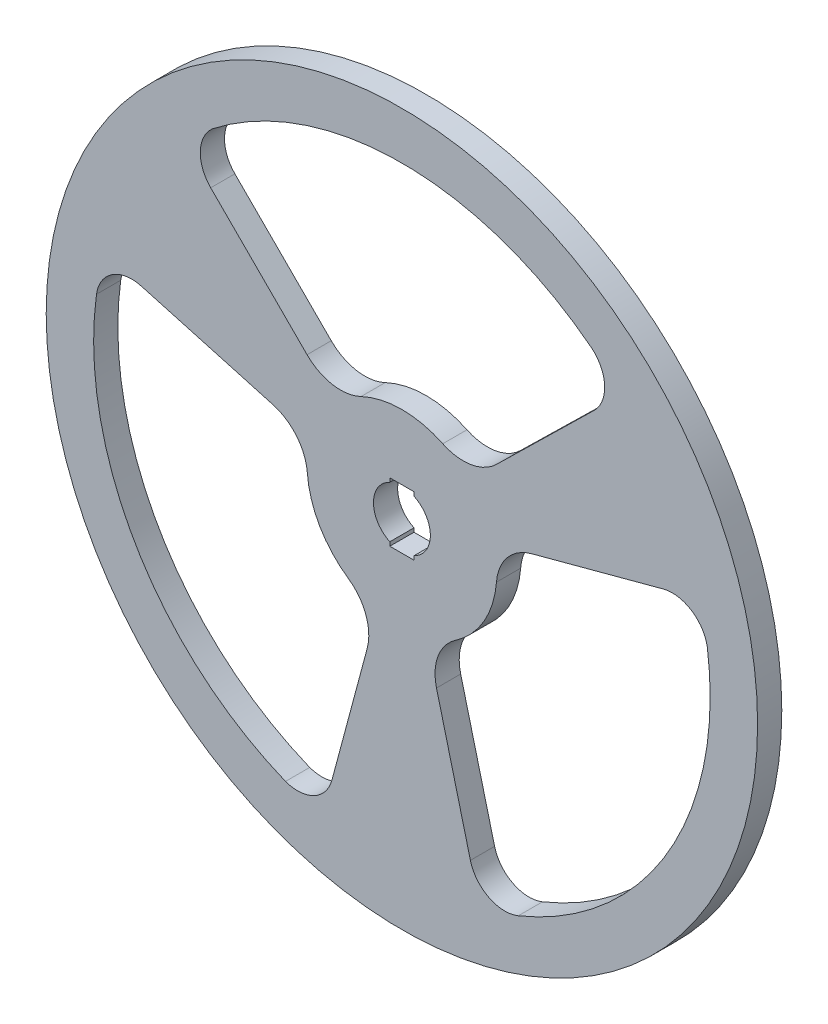
ISO-10303-21;
HEADER;
FILE_DESCRIPTION(('STEP AP214'),'2;1');
FILE_NAME('part.step','',(''),(''),'','','');
FILE_SCHEMA(('AUTOMOTIVE_DESIGN { 1 0 10303 214 1 1 1 1 }'));
ENDSEC;
DATA;
#1=APPLICATION_CONTEXT('core data for automotive mechanical design processes');
#2=APPLICATION_PROTOCOL_DEFINITION('international standard','automotive_design',2000,#1);
#3=PRODUCT_CONTEXT('',#1,'mechanical');
#4=PRODUCT('Part','Part','',(#3));
#5=PRODUCT_RELATED_PRODUCT_CATEGORY('part','',(#4));
#6=PRODUCT_DEFINITION_FORMATION('','',#4);
#7=PRODUCT_DEFINITION_CONTEXT('part definition',#1,'design');
#8=PRODUCT_DEFINITION('design','',#6,#7);
#9=PRODUCT_DEFINITION_SHAPE('','',#8);
#10=(LENGTH_UNIT() NAMED_UNIT(*) SI_UNIT(.MILLI.,.METRE.));
#11=(NAMED_UNIT(*) PLANE_ANGLE_UNIT() SI_UNIT($,.RADIAN.));
#12=(NAMED_UNIT(*) SI_UNIT($,.STERADIAN.) SOLID_ANGLE_UNIT());
#13=UNCERTAINTY_MEASURE_WITH_UNIT(LENGTH_MEASURE(1.E-05),#10,'distance_accuracy_value','');
#14=(GEOMETRIC_REPRESENTATION_CONTEXT(3) GLOBAL_UNCERTAINTY_ASSIGNED_CONTEXT((#13)) GLOBAL_UNIT_ASSIGNED_CONTEXT((#10,
#11,#12)) REPRESENTATION_CONTEXT('',''));
#15=CARTESIAN_POINT('',(0.,0.,0.));
#16=DIRECTION('',(0.,0.,1.));
#17=DIRECTION('',(1.,0.,0.));
#18=AXIS2_PLACEMENT_3D('',#15,#16,#17);
#19=CARTESIAN_POINT('',(0.,0.,5.1));
#20=DIRECTION('',(0.,0.,-1.));
#21=DIRECTION('',(-1.,0.,0.));
#22=AXIS2_PLACEMENT_3D('',#19,#20,#21);
#23=CYLINDRICAL_SURFACE('',#22,6.);
#24=CARTESIAN_POINT('',(0.,0.,5.1));
#25=DIRECTION('',(0.,0.,1.));
#26=DIRECTION('',(1.,0.,0.));
#27=AXIS2_PLACEMENT_3D('',#24,#25,#26);
#28=CIRCLE('',#27,6.);
#29=CARTESIAN_POINT('',(-2.55,5.4311600970695,5.1));
#30=VERTEX_POINT('',#29);
#31=CARTESIAN_POINT('',(-2.55,-5.4311600970695,5.1));
#32=VERTEX_POINT('',#31);
#33=EDGE_CURVE('E392',#30,#32,#28,.T.);
#34=ORIENTED_EDGE('',*,*,#33,.T.);
#35=DIRECTION('',(0.,0.,-1.));
#36=VECTOR('',#35,1.);
#37=CARTESIAN_POINT('',(-2.55,-5.4311600970695,5.1));
#38=LINE('',#37,#36);
#39=CARTESIAN_POINT('',(-2.55,-5.4311600970695,0.));
#40=VERTEX_POINT('',#39);
#41=EDGE_CURVE('E322',#32,#40,#38,.T.);
#42=ORIENTED_EDGE('',*,*,#41,.T.);
#43=CARTESIAN_POINT('',(0.,0.,0.));
#44=DIRECTION('',(0.,0.,1.));
#45=DIRECTION('',(1.,0.,0.));
#46=AXIS2_PLACEMENT_3D('',#43,#44,#45);
#47=CIRCLE('',#46,6.);
#48=CARTESIAN_POINT('',(-2.55,5.4311600970695,0.));
#49=VERTEX_POINT('',#48);
#50=EDGE_CURVE('E296',#49,#40,#47,.T.);
#51=ORIENTED_EDGE('',*,*,#50,.F.);
#52=DIRECTION('',(0.,0.,-1.));
#53=VECTOR('',#52,1.);
#54=CARTESIAN_POINT('',(-2.55,5.4311600970695,5.1));
#55=LINE('',#54,#53);
#56=EDGE_CURVE('E319',#49,#30,#55,.F.);
#57=ORIENTED_EDGE('',*,*,#56,.T.);
#58=EDGE_LOOP('',(#34,#42,#51,#57));
#59=FACE_BOUND('',#58,.T.);
#60=ADVANCED_FACE('F63',(#59),#23,.F.);
#61=CARTESIAN_POINT('',(0.,0.,5.1));
#62=DIRECTION('',(0.,0.,1.));
#63=DIRECTION('',(1.,0.,0.));
#64=AXIS2_PLACEMENT_3D('',#61,#62,#63);
#65=PLANE('',#64);
#66=CARTESIAN_POINT('',(35.2574137113782,45.4220736909349,5.1));
#67=DIRECTION('',(0.,0.,1.));
#68=DIRECTION('',(1.,0.,0.));
#69=AXIS2_PLACEMENT_3D('',#66,#67,#68);
#70=CIRCLE('',#69,7.5);
#71=CARTESIAN_POINT('',(40.5028174644511,40.0615010100313,5.1));
#72=VERTEX_POINT('',#71);
#73=CARTESIAN_POINT('',(39.8562068041667,51.3466919984481,5.1));
#74=VERTEX_POINT('',#73);
#75=EDGE_CURVE('E325',#72,#74,#70,.T.);
#76=ORIENTED_EDGE('',*,*,#75,.F.);
#77=DIRECTION('',(-0.714743024120474,-0.699387167076377,0.));
#78=VECTOR('',#77,1.);
#79=CARTESIAN_POINT('',(-0.214381482132728,0.219088476409293,5.1));
#80=LINE('',#79,#78);
#81=CARTESIAN_POINT('',(19.9228038588983,19.9236375706607,5.1));
#82=VERTEX_POINT('',#81);
#83=EDGE_CURVE('E328',#72,#82,#80,.T.);
#84=ORIENTED_EDGE('',*,*,#83,.T.);
#85=CARTESIAN_POINT('',(12.9289321881345,27.0710678118655,5.1));
#86=DIRECTION('',(0.,0.,1.));
#87=DIRECTION('',(1.,0.,0.));
#88=AXIS2_PLACEMENT_3D('',#85,#86,#87);
#89=CIRCLE('',#88,10.);
#90=CARTESIAN_POINT('',(8.61928812542301,18.0473785412437,5.1));
#91=VERTEX_POINT('',#90);
#92=EDGE_CURVE('E331',#91,#82,#89,.T.);
#93=ORIENTED_EDGE('',*,*,#92,.F.);
#94=CARTESIAN_POINT('',(0.,0.,5.1));
#95=DIRECTION('',(0.,0.,1.));
#96=DIRECTION('',(1.,0.,0.));
#97=AXIS2_PLACEMENT_3D('',#94,#95,#96);
#98=CIRCLE('',#97,20.);
#99=CARTESIAN_POINT('',(-8.61928812542303,18.0473785412436,5.1));
#100=VERTEX_POINT('',#99);
#101=EDGE_CURVE('E334',#91,#100,#98,.T.);
#102=ORIENTED_EDGE('',*,*,#101,.T.);
#103=CARTESIAN_POINT('',(-12.9289321881345,27.0710678118655,5.1));
#104=DIRECTION('',(0.,0.,1.));
#105=DIRECTION('',(1.,0.,0.));
#106=AXIS2_PLACEMENT_3D('',#103,#104,#105);
#107=CIRCLE('',#106,10.);
#108=CARTESIAN_POINT('',(-20.,20.,5.1));
#109=VERTEX_POINT('',#108);
#110=EDGE_CURVE('E336',#109,#100,#107,.T.);
#111=ORIENTED_EDGE('',*,*,#110,.F.);
#112=DIRECTION('',(-0.707106781186548,0.707106781186547,0.));
#113=VECTOR('',#112,1.);
#114=CARTESIAN_POINT('',(0.,0.,5.1));
#115=LINE('',#114,#113);
#116=CARTESIAN_POINT('',(-40.316594862155,40.316594862155,5.1));
#117=VERTEX_POINT('',#116);
#118=EDGE_CURVE('E339',#109,#117,#115,.T.);
#119=ORIENTED_EDGE('',*,*,#118,.T.);
#120=CARTESIAN_POINT('',(-35.0132940032559,45.6198957210541,5.1));
#121=DIRECTION('',(0.,0.,1.));
#122=DIRECTION('',(1.,0.,0.));
#123=AXIS2_PLACEMENT_3D('',#120,#121,#122);
#124=CIRCLE('',#123,7.50000000000001);
#125=CARTESIAN_POINT('',(-39.8562068041667,51.3466919984481,5.1));
#126=VERTEX_POINT('',#125);
#127=EDGE_CURVE('E341',#126,#117,#124,.T.);
#128=ORIENTED_EDGE('',*,*,#127,.F.);
#129=CARTESIAN_POINT('',(0.,0.,5.1));
#130=DIRECTION('',(0.,0.,1.));
#131=DIRECTION('',(1.,0.,0.));
#132=AXIS2_PLACEMENT_3D('',#129,#130,#131);
#133=CIRCLE('',#132,65.);
#134=EDGE_CURVE('E344',#74,#126,#133,.T.);
#135=ORIENTED_EDGE('',*,*,#134,.F.);
#136=EDGE_LOOP('',(#76,#84,#93,#102,#111,#119,#128,#135));
#137=FACE_BOUND('',#136,.T.);
#138=CARTESIAN_POINT('',(-56.9653765646075,7.82277910032393,5.1));
#139=DIRECTION('',(0.,0.,1.));
#140=DIRECTION('',(1.,0.,0.));
#141=AXIS2_PLACEMENT_3D('',#138,#139,#140);
#142=CIRCLE('',#141,7.5);
#143=CARTESIAN_POINT('',(-54.9456863206486,15.045718344043,5.1));
#144=VERTEX_POINT('',#143);
#145=CARTESIAN_POINT('',(-64.3956430730346,8.84314159167053,5.1));
#146=VERTEX_POINT('',#145);
#147=EDGE_CURVE('E347',#144,#146,#142,.T.);
#148=ORIENTED_EDGE('',*,*,#147,.F.);
#149=DIRECTION('',(0.963058565829211,-0.269292032527856,0.));
#150=VECTOR('',#149,1.);
#151=CARTESIAN_POINT('',(-0.0825454451805127,-0.295204047832552,5.1));
#152=LINE('',#151,#150);
#153=CARTESIAN_POINT('',(-27.2157782014354,7.2918354710902,5.1));
#154=VERTEX_POINT('',#153);
#155=EDGE_CURVE('E350',#144,#154,#152,.T.);
#156=ORIENTED_EDGE('',*,*,#155,.T.);
#157=CARTESIAN_POINT('',(-29.908698526714,-2.33875018720191,5.1));
#158=DIRECTION('',(0.,0.,1.));
#159=DIRECTION('',(1.,0.,0.));
#160=AXIS2_PLACEMENT_3D('',#157,#158,#159);
#161=CIRCLE('',#160,10.);
#162=CARTESIAN_POINT('',(-19.9391323511426,-1.55916679146795,5.1));
#163=VERTEX_POINT('',#162);
#164=EDGE_CURVE('E352',#163,#154,#161,.T.);
#165=ORIENTED_EDGE('',*,*,#164,.F.);
#166=CARTESIAN_POINT('',(0.,0.,5.1));
#167=DIRECTION('',(0.,0.,1.));
#168=DIRECTION('',(1.,0.,0.));
#169=AXIS2_PLACEMENT_3D('',#166,#167,#168);
#170=CIRCLE('',#169,20.);
#171=CARTESIAN_POINT('',(-11.3198442257196,-16.4882117497757,5.1));
#172=VERTEX_POINT('',#171);
#173=EDGE_CURVE('E355',#163,#172,#170,.T.);
#174=ORIENTED_EDGE('',*,*,#173,.T.);
#175=CARTESIAN_POINT('',(-16.9797663385794,-24.7323176246636,5.1));
#176=DIRECTION('',(0.,0.,1.));
#177=DIRECTION('',(1.,0.,0.));
#178=AXIS2_PLACEMENT_3D('',#175,#176,#177);
#179=CIRCLE('',#178,10.);
#180=CARTESIAN_POINT('',(-7.32050807568877,-27.3205080756888,5.1));
#181=VERTEX_POINT('',#180);
#182=EDGE_CURVE('E357',#181,#172,#179,.T.);
#183=ORIENTED_EDGE('',*,*,#182,.F.);
#184=DIRECTION('',(-0.258819045102521,-0.965925826289068,0.));
#185=VECTOR('',#184,1.);
#186=CARTESIAN_POINT('',(0.,0.,5.1));
#187=LINE('',#186,#185);
#188=CARTESIAN_POINT('',(-14.7568979136339,-55.0734927757889,5.1));
#189=VERTEX_POINT('',#188);
#190=EDGE_CURVE('E360',#181,#189,#187,.T.);
#191=ORIENTED_EDGE('',*,*,#190,.T.);
#192=CARTESIAN_POINT('',(-22.0013416108019,-53.13234993752,5.1));
#193=DIRECTION('',(0.,0.,1.));
#194=DIRECTION('',(1.,0.,0.));
#195=AXIS2_PLACEMENT_3D('',#192,#193,#194);
#196=CIRCLE('',#195,7.50000000000001);
#197=CARTESIAN_POINT('',(-24.5394362688679,-60.1898335901186,5.1));
#198=VERTEX_POINT('',#197);
#199=EDGE_CURVE('E362',#198,#189,#196,.T.);
#200=ORIENTED_EDGE('',*,*,#199,.F.);
#201=CARTESIAN_POINT('',(0.,0.,5.1));
#202=DIRECTION('',(0.,0.,1.));
#203=DIRECTION('',(1.,0.,0.));
#204=AXIS2_PLACEMENT_3D('',#201,#202,#203);
#205=CIRCLE('',#204,65.);
#206=EDGE_CURVE('E365',#146,#198,#205,.T.);
#207=ORIENTED_EDGE('',*,*,#206,.F.);
#208=EDGE_LOOP('',(#148,#156,#165,#174,#183,#191,#200,#207));
#209=FACE_BOUND('',#208,.T.);
#210=CARTESIAN_POINT('',(21.7079628532293,-53.2448527912588,5.1));
#211=DIRECTION('',(0.,0.,1.));
#212=DIRECTION('',(1.,0.,0.));
#213=AXIS2_PLACEMENT_3D('',#210,#211,#212);
#214=CIRCLE('',#213,7.49999999999999);
#215=CARTESIAN_POINT('',(14.4428688561976,-55.1072193540743,5.1));
#216=VERTEX_POINT('',#215);
#217=CARTESIAN_POINT('',(24.5394362688679,-60.1898335901186,5.1));
#218=VERTEX_POINT('',#217);
#219=EDGE_CURVE('E368',#216,#218,#214,.T.);
#220=ORIENTED_EDGE('',*,*,#219,.F.);
#221=DIRECTION('',(-0.248315541708738,0.968679199604232,0.));
#222=VECTOR('',#221,1.);
#223=CARTESIAN_POINT('',(0.296926927313197,0.0761155714232449,5.1));
#224=LINE('',#223,#222);
#225=CARTESIAN_POINT('',(7.29297434253713,-27.2154730417509,5.1));
#226=VERTEX_POINT('',#225);
#227=EDGE_CURVE('E371',#216,#226,#224,.T.);
#228=ORIENTED_EDGE('',*,*,#227,.T.);
#229=CARTESIAN_POINT('',(16.9797663385795,-24.7323176246636,5.1));
#230=DIRECTION('',(0.,0.,1.));
#231=DIRECTION('',(1.,0.,0.));
#232=AXIS2_PLACEMENT_3D('',#229,#230,#231);
#233=CIRCLE('',#232,10.);
#234=CARTESIAN_POINT('',(11.3198442257196,-16.4882117497757,5.1));
#235=VERTEX_POINT('',#234);
#236=EDGE_CURVE('E373',#235,#226,#233,.T.);
#237=ORIENTED_EDGE('',*,*,#236,.F.);
#238=CARTESIAN_POINT('',(0.,0.,5.1));
#239=DIRECTION('',(0.,0.,1.));
#240=DIRECTION('',(1.,0.,0.));
#241=AXIS2_PLACEMENT_3D('',#238,#239,#240);
#242=CIRCLE('',#241,20.);
#243=CARTESIAN_POINT('',(19.9391323511427,-1.55916679146793,5.1));
#244=VERTEX_POINT('',#243);
#245=EDGE_CURVE('E376',#235,#244,#242,.T.);
#246=ORIENTED_EDGE('',*,*,#245,.T.);
#247=CARTESIAN_POINT('',(29.908698526714,-2.33875018720191,5.1));
#248=DIRECTION('',(0.,0.,1.));
#249=DIRECTION('',(1.,0.,0.));
#250=AXIS2_PLACEMENT_3D('',#247,#248,#249);
#251=CIRCLE('',#250,10.);
#252=CARTESIAN_POINT('',(27.3205080756888,7.32050807568877,5.1));
#253=VERTEX_POINT('',#252);
#254=EDGE_CURVE('E378',#253,#244,#251,.T.);
#255=ORIENTED_EDGE('',*,*,#254,.F.);
#256=DIRECTION('',(0.965925826289068,0.258819045102521,0.));
#257=VECTOR('',#256,1.);
#258=CARTESIAN_POINT('',(0.,0.,5.1));
#259=LINE('',#258,#257);
#260=CARTESIAN_POINT('',(55.0734927757889,14.7568979136339,5.1));
#261=VERTEX_POINT('',#260);
#262=EDGE_CURVE('E381',#253,#261,#259,.T.);
#263=ORIENTED_EDGE('',*,*,#262,.T.);
#264=CARTESIAN_POINT('',(57.0146356140578,7.51245421646588,5.1));
#265=DIRECTION('',(0.,0.,1.));
#266=DIRECTION('',(1.,0.,0.));
#267=AXIS2_PLACEMENT_3D('',#264,#265,#266);
#268=CIRCLE('',#267,7.5);
#269=CARTESIAN_POINT('',(64.3956430730346,8.8431415916705,5.1));
#270=VERTEX_POINT('',#269);
#271=EDGE_CURVE('E383',#270,#261,#268,.T.);
#272=ORIENTED_EDGE('',*,*,#271,.F.);
#273=CARTESIAN_POINT('',(0.,0.,5.1));
#274=DIRECTION('',(0.,0.,1.));
#275=DIRECTION('',(1.,0.,0.));
#276=AXIS2_PLACEMENT_3D('',#273,#274,#275);
#277=CIRCLE('',#276,65.);
#278=EDGE_CURVE('E386',#218,#270,#277,.T.);
#279=ORIENTED_EDGE('',*,*,#278,.F.);
#280=EDGE_LOOP('',(#220,#228,#237,#246,#255,#263,#272,#279));
#281=FACE_BOUND('',#280,.T.);
#282=CARTESIAN_POINT('',(0.,0.,5.1));
#283=DIRECTION('',(0.,0.,1.));
#284=DIRECTION('',(1.,0.,0.));
#285=AXIS2_PLACEMENT_3D('',#282,#283,#284);
#286=CIRCLE('',#285,75.);
#287=CARTESIAN_POINT('',(75.,0.,5.1));
#288=VERTEX_POINT('',#287);
#289=EDGE_CURVE('E393',#288,#288,#286,.T.);
#290=ORIENTED_EDGE('',*,*,#289,.T.);
#291=EDGE_LOOP('',(#290));
#292=FACE_BOUND('',#291,.T.);
#293=DIRECTION('',(-1.,0.,0.));
#294=VECTOR('',#293,1.);
#295=CARTESIAN_POINT('',(0.,-6.25,5.1));
#296=LINE('',#295,#294);
#297=CARTESIAN_POINT('',(2.55,-6.25,5.1));
#298=VERTEX_POINT('',#297);
#299=CARTESIAN_POINT('',(-2.55,-6.25,5.1));
#300=VERTEX_POINT('',#299);
#301=EDGE_CURVE('E306',#298,#300,#296,.T.);
#302=ORIENTED_EDGE('',*,*,#301,.T.);
#303=DIRECTION('',(0.,1.,0.));
#304=VECTOR('',#303,1.);
#305=CARTESIAN_POINT('',(-2.55,0.,5.1));
#306=LINE('',#305,#304);
#307=EDGE_CURVE('E288',#300,#32,#306,.T.);
#308=ORIENTED_EDGE('',*,*,#307,.T.);
#309=ORIENTED_EDGE('',*,*,#33,.F.);
#310=CARTESIAN_POINT('',(-2.55,6.25,5.1));
#311=VERTEX_POINT('',#310);
#312=EDGE_CURVE('E307',#30,#311,#306,.T.);
#313=ORIENTED_EDGE('',*,*,#312,.T.);
#314=DIRECTION('',(-1.,0.,0.));
#315=VECTOR('',#314,1.);
#316=CARTESIAN_POINT('',(0.,6.25,5.1));
#317=LINE('',#316,#315);
#318=CARTESIAN_POINT('',(2.55,6.25,5.1));
#319=VERTEX_POINT('',#318);
#320=EDGE_CURVE('E297',#319,#311,#317,.T.);
#321=ORIENTED_EDGE('',*,*,#320,.F.);
#322=DIRECTION('',(0.,1.,0.));
#323=VECTOR('',#322,1.);
#324=CARTESIAN_POINT('',(2.55,0.,5.1));
#325=LINE('',#324,#323);
#326=CARTESIAN_POINT('',(2.55,5.4311600970695,5.1));
#327=VERTEX_POINT('',#326);
#328=EDGE_CURVE('E309',#327,#319,#325,.T.);
#329=ORIENTED_EDGE('',*,*,#328,.F.);
#330=CARTESIAN_POINT('',(2.55,-5.4311600970695,5.1));
#331=VERTEX_POINT('',#330);
#332=EDGE_CURVE('E389',#331,#327,#28,.T.);
#333=ORIENTED_EDGE('',*,*,#332,.F.);
#334=EDGE_CURVE('E299',#298,#331,#325,.T.);
#335=ORIENTED_EDGE('',*,*,#334,.F.);
#336=EDGE_LOOP('',(#302,#308,#309,#313,#321,#329,#333,#335));
#337=FACE_BOUND('',#336,.T.);
#338=ADVANCED_FACE('F530',(#137,#209,#281,#292,#337),#65,.T.);
#339=CARTESIAN_POINT('',(0.,0.,0.));
#340=DIRECTION('',(0.,0.,1.));
#341=DIRECTION('',(1.,0.,0.));
#342=AXIS2_PLACEMENT_3D('',#339,#340,#341);
#343=PLANE('',#342);
#344=CARTESIAN_POINT('',(35.2574137113782,45.4220736909349,0.));
#345=DIRECTION('',(0.,0.,1.));
#346=DIRECTION('',(1.,0.,0.));
#347=AXIS2_PLACEMENT_3D('',#344,#345,#346);
#348=CIRCLE('',#347,7.5);
#349=CARTESIAN_POINT('',(40.5028174644511,40.0615010100313,0.));
#350=VERTEX_POINT('',#349);
#351=CARTESIAN_POINT('',(39.8562068041667,51.3466919984481,0.));
#352=VERTEX_POINT('',#351);
#353=EDGE_CURVE('E324',#350,#352,#348,.T.);
#354=ORIENTED_EDGE('',*,*,#353,.T.);
#355=CARTESIAN_POINT('',(0.,0.,0.));
#356=DIRECTION('',(0.,0.,1.));
#357=DIRECTION('',(1.,0.,0.));
#358=AXIS2_PLACEMENT_3D('',#355,#356,#357);
#359=CIRCLE('',#358,65.);
#360=CARTESIAN_POINT('',(-39.8562068041667,51.3466919984481,0.));
#361=VERTEX_POINT('',#360);
#362=EDGE_CURVE('E417',#352,#361,#359,.T.);
#363=ORIENTED_EDGE('',*,*,#362,.T.);
#364=CARTESIAN_POINT('',(-35.0132940032559,45.6198957210541,0.));
#365=DIRECTION('',(0.,0.,1.));
#366=DIRECTION('',(1.,0.,0.));
#367=AXIS2_PLACEMENT_3D('',#364,#365,#366);
#368=CIRCLE('',#367,7.50000000000001);
#369=CARTESIAN_POINT('',(-40.316594862155,40.316594862155,0.));
#370=VERTEX_POINT('',#369);
#371=EDGE_CURVE('E414',#361,#370,#368,.T.);
#372=ORIENTED_EDGE('',*,*,#371,.T.);
#373=DIRECTION('',(-0.707106781186548,0.707106781186547,0.));
#374=VECTOR('',#373,1.);
#375=CARTESIAN_POINT('',(0.,0.,0.));
#376=LINE('',#375,#374);
#377=CARTESIAN_POINT('',(-20.,20.,0.));
#378=VERTEX_POINT('',#377);
#379=EDGE_CURVE('E411',#378,#370,#376,.T.);
#380=ORIENTED_EDGE('',*,*,#379,.F.);
#381=CARTESIAN_POINT('',(-12.9289321881345,27.0710678118655,0.));
#382=DIRECTION('',(0.,0.,1.));
#383=DIRECTION('',(1.,0.,0.));
#384=AXIS2_PLACEMENT_3D('',#381,#382,#383);
#385=CIRCLE('',#384,10.);
#386=CARTESIAN_POINT('',(-8.61928812542303,18.0473785412436,0.));
#387=VERTEX_POINT('',#386);
#388=EDGE_CURVE('E408',#378,#387,#385,.T.);
#389=ORIENTED_EDGE('',*,*,#388,.T.);
#390=CARTESIAN_POINT('',(0.,0.,0.));
#391=DIRECTION('',(0.,0.,1.));
#392=DIRECTION('',(1.,0.,0.));
#393=AXIS2_PLACEMENT_3D('',#390,#391,#392);
#394=CIRCLE('',#393,20.);
#395=CARTESIAN_POINT('',(8.61928812542301,18.0473785412437,0.));
#396=VERTEX_POINT('',#395);
#397=EDGE_CURVE('E405',#396,#387,#394,.T.);
#398=ORIENTED_EDGE('',*,*,#397,.F.);
#399=CARTESIAN_POINT('',(12.9289321881345,27.0710678118655,0.));
#400=DIRECTION('',(0.,0.,1.));
#401=DIRECTION('',(1.,0.,0.));
#402=AXIS2_PLACEMENT_3D('',#399,#400,#401);
#403=CIRCLE('',#402,10.);
#404=CARTESIAN_POINT('',(19.9228038588983,19.9236375706607,0.));
#405=VERTEX_POINT('',#404);
#406=EDGE_CURVE('E402',#396,#405,#403,.T.);
#407=ORIENTED_EDGE('',*,*,#406,.T.);
#408=DIRECTION('',(-0.714743024120474,-0.699387167076377,0.));
#409=VECTOR('',#408,1.);
#410=CARTESIAN_POINT('',(-0.214381482132728,0.219088476409293,0.));
#411=LINE('',#410,#409);
#412=EDGE_CURVE('E399',#350,#405,#411,.T.);
#413=ORIENTED_EDGE('',*,*,#412,.F.);
#414=EDGE_LOOP('',(#354,#363,#372,#380,#389,#398,#407,#413));
#415=FACE_BOUND('',#414,.T.);
#416=CARTESIAN_POINT('',(-56.9653765646075,7.82277910032393,0.));
#417=DIRECTION('',(0.,0.,1.));
#418=DIRECTION('',(1.,0.,0.));
#419=AXIS2_PLACEMENT_3D('',#416,#417,#418);
#420=CIRCLE('',#419,7.5);
#421=CARTESIAN_POINT('',(-54.9456863206486,15.045718344043,0.));
#422=VERTEX_POINT('',#421);
#423=CARTESIAN_POINT('',(-64.3956430730346,8.84314159167053,0.));
#424=VERTEX_POINT('',#423);
#425=EDGE_CURVE('E420',#422,#424,#420,.T.);
#426=ORIENTED_EDGE('',*,*,#425,.T.);
#427=CARTESIAN_POINT('',(0.,0.,0.));
#428=DIRECTION('',(0.,0.,1.));
#429=DIRECTION('',(1.,0.,0.));
#430=AXIS2_PLACEMENT_3D('',#427,#428,#429);
#431=CIRCLE('',#430,65.);
#432=CARTESIAN_POINT('',(-24.5394362688679,-60.1898335901186,0.));
#433=VERTEX_POINT('',#432);
#434=EDGE_CURVE('E441',#424,#433,#431,.T.);
#435=ORIENTED_EDGE('',*,*,#434,.T.);
#436=CARTESIAN_POINT('',(-22.0013416108019,-53.13234993752,0.));
#437=DIRECTION('',(0.,0.,1.));
#438=DIRECTION('',(1.,0.,0.));
#439=AXIS2_PLACEMENT_3D('',#436,#437,#438);
#440=CIRCLE('',#439,7.50000000000001);
#441=CARTESIAN_POINT('',(-14.7568979136339,-55.0734927757889,0.));
#442=VERTEX_POINT('',#441);
#443=EDGE_CURVE('E438',#433,#442,#440,.T.);
#444=ORIENTED_EDGE('',*,*,#443,.T.);
#445=DIRECTION('',(-0.258819045102521,-0.965925826289068,0.));
#446=VECTOR('',#445,1.);
#447=CARTESIAN_POINT('',(0.,0.,0.));
#448=LINE('',#447,#446);
#449=CARTESIAN_POINT('',(-7.32050807568877,-27.3205080756888,0.));
#450=VERTEX_POINT('',#449);
#451=EDGE_CURVE('E435',#450,#442,#448,.T.);
#452=ORIENTED_EDGE('',*,*,#451,.F.);
#453=CARTESIAN_POINT('',(-16.9797663385794,-24.7323176246636,0.));
#454=DIRECTION('',(0.,0.,1.));
#455=DIRECTION('',(1.,0.,0.));
#456=AXIS2_PLACEMENT_3D('',#453,#454,#455);
#457=CIRCLE('',#456,10.);
#458=CARTESIAN_POINT('',(-11.3198442257196,-16.4882117497757,0.));
#459=VERTEX_POINT('',#458);
#460=EDGE_CURVE('E432',#450,#459,#457,.T.);
#461=ORIENTED_EDGE('',*,*,#460,.T.);
#462=CARTESIAN_POINT('',(0.,0.,0.));
#463=DIRECTION('',(0.,0.,1.));
#464=DIRECTION('',(1.,0.,0.));
#465=AXIS2_PLACEMENT_3D('',#462,#463,#464);
#466=CIRCLE('',#465,20.);
#467=CARTESIAN_POINT('',(-19.9391323511426,-1.55916679146795,0.));
#468=VERTEX_POINT('',#467);
#469=EDGE_CURVE('E429',#468,#459,#466,.T.);
#470=ORIENTED_EDGE('',*,*,#469,.F.);
#471=CARTESIAN_POINT('',(-29.908698526714,-2.33875018720191,0.));
#472=DIRECTION('',(0.,0.,1.));
#473=DIRECTION('',(1.,0.,0.));
#474=AXIS2_PLACEMENT_3D('',#471,#472,#473);
#475=CIRCLE('',#474,10.);
#476=CARTESIAN_POINT('',(-27.2157782014354,7.2918354710902,0.));
#477=VERTEX_POINT('',#476);
#478=EDGE_CURVE('E426',#468,#477,#475,.T.);
#479=ORIENTED_EDGE('',*,*,#478,.T.);
#480=DIRECTION('',(0.963058565829211,-0.269292032527856,0.));
#481=VECTOR('',#480,1.);
#482=CARTESIAN_POINT('',(-0.0825454451805127,-0.295204047832552,0.));
#483=LINE('',#482,#481);
#484=EDGE_CURVE('E423',#422,#477,#483,.T.);
#485=ORIENTED_EDGE('',*,*,#484,.F.);
#486=EDGE_LOOP('',(#426,#435,#444,#452,#461,#470,#479,#485));
#487=FACE_BOUND('',#486,.T.);
#488=CARTESIAN_POINT('',(21.7079628532293,-53.2448527912588,0.));
#489=DIRECTION('',(0.,0.,1.));
#490=DIRECTION('',(1.,0.,0.));
#491=AXIS2_PLACEMENT_3D('',#488,#489,#490);
#492=CIRCLE('',#491,7.49999999999999);
#493=CARTESIAN_POINT('',(14.4428688561976,-55.1072193540743,0.));
#494=VERTEX_POINT('',#493);
#495=CARTESIAN_POINT('',(24.5394362688679,-60.1898335901186,0.));
#496=VERTEX_POINT('',#495);
#497=EDGE_CURVE('E444',#494,#496,#492,.T.);
#498=ORIENTED_EDGE('',*,*,#497,.T.);
#499=CARTESIAN_POINT('',(0.,0.,0.));
#500=DIRECTION('',(0.,0.,1.));
#501=DIRECTION('',(1.,0.,0.));
#502=AXIS2_PLACEMENT_3D('',#499,#500,#501);
#503=CIRCLE('',#502,65.);
#504=CARTESIAN_POINT('',(64.3956430730346,8.8431415916705,0.));
#505=VERTEX_POINT('',#504);
#506=EDGE_CURVE('E465',#496,#505,#503,.T.);
#507=ORIENTED_EDGE('',*,*,#506,.T.);
#508=CARTESIAN_POINT('',(57.0146356140578,7.51245421646588,0.));
#509=DIRECTION('',(0.,0.,1.));
#510=DIRECTION('',(1.,0.,0.));
#511=AXIS2_PLACEMENT_3D('',#508,#509,#510);
#512=CIRCLE('',#511,7.5);
#513=CARTESIAN_POINT('',(55.0734927757889,14.7568979136339,0.));
#514=VERTEX_POINT('',#513);
#515=EDGE_CURVE('E462',#505,#514,#512,.T.);
#516=ORIENTED_EDGE('',*,*,#515,.T.);
#517=DIRECTION('',(0.965925826289068,0.258819045102521,0.));
#518=VECTOR('',#517,1.);
#519=CARTESIAN_POINT('',(0.,0.,0.));
#520=LINE('',#519,#518);
#521=CARTESIAN_POINT('',(27.3205080756888,7.32050807568877,0.));
#522=VERTEX_POINT('',#521);
#523=EDGE_CURVE('E459',#522,#514,#520,.T.);
#524=ORIENTED_EDGE('',*,*,#523,.F.);
#525=CARTESIAN_POINT('',(29.908698526714,-2.33875018720191,0.));
#526=DIRECTION('',(0.,0.,1.));
#527=DIRECTION('',(1.,0.,0.));
#528=AXIS2_PLACEMENT_3D('',#525,#526,#527);
#529=CIRCLE('',#528,10.);
#530=CARTESIAN_POINT('',(19.9391323511427,-1.55916679146793,0.));
#531=VERTEX_POINT('',#530);
#532=EDGE_CURVE('E456',#522,#531,#529,.T.);
#533=ORIENTED_EDGE('',*,*,#532,.T.);
#534=CARTESIAN_POINT('',(0.,0.,0.));
#535=DIRECTION('',(0.,0.,1.));
#536=DIRECTION('',(1.,0.,0.));
#537=AXIS2_PLACEMENT_3D('',#534,#535,#536);
#538=CIRCLE('',#537,20.);
#539=CARTESIAN_POINT('',(11.3198442257196,-16.4882117497757,0.));
#540=VERTEX_POINT('',#539);
#541=EDGE_CURVE('E453',#540,#531,#538,.T.);
#542=ORIENTED_EDGE('',*,*,#541,.F.);
#543=CARTESIAN_POINT('',(16.9797663385795,-24.7323176246636,0.));
#544=DIRECTION('',(0.,0.,1.));
#545=DIRECTION('',(1.,0.,0.));
#546=AXIS2_PLACEMENT_3D('',#543,#544,#545);
#547=CIRCLE('',#546,10.);
#548=CARTESIAN_POINT('',(7.29297434253713,-27.2154730417509,0.));
#549=VERTEX_POINT('',#548);
#550=EDGE_CURVE('E450',#540,#549,#547,.T.);
#551=ORIENTED_EDGE('',*,*,#550,.T.);
#552=DIRECTION('',(-0.248315541708738,0.968679199604232,0.));
#553=VECTOR('',#552,1.);
#554=CARTESIAN_POINT('',(0.296926927313197,0.0761155714232449,0.));
#555=LINE('',#554,#553);
#556=EDGE_CURVE('E447',#494,#549,#555,.T.);
#557=ORIENTED_EDGE('',*,*,#556,.F.);
#558=EDGE_LOOP('',(#498,#507,#516,#524,#533,#542,#551,#557));
#559=FACE_BOUND('',#558,.T.);
#560=CARTESIAN_POINT('',(0.,0.,0.));
#561=DIRECTION('',(0.,0.,1.));
#562=DIRECTION('',(1.,0.,0.));
#563=AXIS2_PLACEMENT_3D('',#560,#561,#562);
#564=CIRCLE('',#563,75.);
#565=CARTESIAN_POINT('',(75.,0.,0.));
#566=VERTEX_POINT('',#565);
#567=EDGE_CURVE('E329',#566,#566,#564,.T.);
#568=ORIENTED_EDGE('',*,*,#567,.F.);
#569=EDGE_LOOP('',(#568));
#570=FACE_BOUND('',#569,.T.);
#571=DIRECTION('',(0.,1.,0.));
#572=VECTOR('',#571,1.);
#573=CARTESIAN_POINT('',(-2.55,0.,0.));
#574=LINE('',#573,#572);
#575=CARTESIAN_POINT('',(-2.55,-6.25,0.));
#576=VERTEX_POINT('',#575);
#577=EDGE_CURVE('E282',#576,#40,#574,.T.);
#578=ORIENTED_EDGE('',*,*,#577,.F.);
#579=DIRECTION('',(-1.,0.,0.));
#580=VECTOR('',#579,1.);
#581=CARTESIAN_POINT('',(0.,-6.25,0.));
#582=LINE('',#581,#580);
#583=CARTESIAN_POINT('',(2.55,-6.25,0.));
#584=VERTEX_POINT('',#583);
#585=EDGE_CURVE('E272',#584,#576,#582,.T.);
#586=ORIENTED_EDGE('',*,*,#585,.F.);
#587=DIRECTION('',(0.,1.,0.));
#588=VECTOR('',#587,1.);
#589=CARTESIAN_POINT('',(2.55,0.,0.));
#590=LINE('',#589,#588);
#591=CARTESIAN_POINT('',(2.55,-5.4311600970695,0.));
#592=VERTEX_POINT('',#591);
#593=EDGE_CURVE('E281',#584,#592,#590,.T.);
#594=ORIENTED_EDGE('',*,*,#593,.T.);
#595=CARTESIAN_POINT('',(2.55,5.4311600970695,0.));
#596=VERTEX_POINT('',#595);
#597=EDGE_CURVE('E468',#592,#596,#47,.T.);
#598=ORIENTED_EDGE('',*,*,#597,.T.);
#599=DIRECTION('',(0.,1.,0.));
#600=VECTOR('',#599,1.);
#601=CARTESIAN_POINT('',(2.55,0.,0.));
#602=LINE('',#601,#600);
#603=CARTESIAN_POINT('',(2.55,6.25,0.));
#604=VERTEX_POINT('',#603);
#605=EDGE_CURVE('E71',#596,#604,#602,.T.);
#606=ORIENTED_EDGE('',*,*,#605,.T.);
#607=DIRECTION('',(-1.,0.,0.));
#608=VECTOR('',#607,1.);
#609=CARTESIAN_POINT('',(0.,6.25,0.));
#610=LINE('',#609,#608);
#611=CARTESIAN_POINT('',(-2.55,6.25,0.));
#612=VERTEX_POINT('',#611);
#613=EDGE_CURVE('E290',#604,#612,#610,.T.);
#614=ORIENTED_EDGE('',*,*,#613,.T.);
#615=DIRECTION('',(0.,1.,0.));
#616=VECTOR('',#615,1.);
#617=CARTESIAN_POINT('',(-2.55,0.,0.));
#618=LINE('',#617,#616);
#619=EDGE_CURVE('E12',#49,#612,#618,.T.);
#620=ORIENTED_EDGE('',*,*,#619,.F.);
#621=ORIENTED_EDGE('',*,*,#50,.T.);
#622=EDGE_LOOP('',(#578,#586,#594,#598,#606,#614,#620,#621));
#623=FACE_BOUND('',#622,.T.);
#624=ADVANCED_FACE('F293',(#415,#487,#559,#570,#623),#343,.F.);
#625=CARTESIAN_POINT('',(21.7079628532293,-53.2448527912588,5.1));
#626=DIRECTION('',(0.,0.,-1.));
#627=DIRECTION('',(-1.,0.,0.));
#628=AXIS2_PLACEMENT_3D('',#625,#626,#627);
#629=CYLINDRICAL_SURFACE('',#628,7.49999999999999);
#630=ORIENTED_EDGE('',*,*,#497,.F.);
#631=DIRECTION('',(0.,0.,-1.));
#632=VECTOR('',#631,1.);
#633=CARTESIAN_POINT('',(14.4428688561976,-55.1072193540743,5.1));
#634=LINE('',#633,#632);
#635=EDGE_CURVE('E488',#216,#494,#634,.T.);
#636=ORIENTED_EDGE('',*,*,#635,.F.);
#637=ORIENTED_EDGE('',*,*,#219,.T.);
#638=DIRECTION('',(0.,0.,-1.));
#639=VECTOR('',#638,1.);
#640=CARTESIAN_POINT('',(24.5394362688679,-60.1898335901186,5.1));
#641=LINE('',#640,#639);
#642=EDGE_CURVE('E473',#218,#496,#641,.T.);
#643=ORIENTED_EDGE('',*,*,#642,.T.);
#644=EDGE_LOOP('',(#630,#636,#637,#643));
#645=FACE_BOUND('',#644,.T.);
#646=ADVANCED_FACE('F625',(#645),#629,.F.);
#647=CARTESIAN_POINT('',(0.296926927313197,0.0761155714232449,5.1));
#648=DIRECTION('',(-0.968679199604232,-0.248315541708738,0.));
#649=DIRECTION('',(0.248315541708738,-0.968679199604232,0.));
#650=AXIS2_PLACEMENT_3D('',#647,#648,#649);
#651=PLANE('',#650);
#652=ORIENTED_EDGE('',*,*,#556,.T.);
#653=DIRECTION('',(0.,0.,-1.));
#654=VECTOR('',#653,1.);
#655=CARTESIAN_POINT('',(7.29297434253713,-27.2154730417509,5.1));
#656=LINE('',#655,#654);
#657=EDGE_CURVE('E486',#226,#549,#656,.T.);
#658=ORIENTED_EDGE('',*,*,#657,.F.);
#659=ORIENTED_EDGE('',*,*,#227,.F.);
#660=ORIENTED_EDGE('',*,*,#635,.T.);
#661=EDGE_LOOP('',(#652,#658,#659,#660));
#662=FACE_BOUND('',#661,.T.);
#663=ADVANCED_FACE('F691',(#662),#651,.F.);
#664=CARTESIAN_POINT('',(16.9797663385795,-24.7323176246636,5.1));
#665=DIRECTION('',(0.,0.,-1.));
#666=DIRECTION('',(-1.,0.,0.));
#667=AXIS2_PLACEMENT_3D('',#664,#665,#666);
#668=CYLINDRICAL_SURFACE('',#667,10.);
#669=ORIENTED_EDGE('',*,*,#550,.F.);
#670=DIRECTION('',(0.,0.,-1.));
#671=VECTOR('',#670,1.);
#672=CARTESIAN_POINT('',(11.3198442257196,-16.4882117497757,5.1));
#673=LINE('',#672,#671);
#674=EDGE_CURVE('E484',#235,#540,#673,.T.);
#675=ORIENTED_EDGE('',*,*,#674,.F.);
#676=ORIENTED_EDGE('',*,*,#236,.T.);
#677=ORIENTED_EDGE('',*,*,#657,.T.);
#678=EDGE_LOOP('',(#669,#675,#676,#677));
#679=FACE_BOUND('',#678,.T.);
#680=ADVANCED_FACE('F890',(#679),#668,.F.);
#681=CARTESIAN_POINT('',(0.,0.,5.1));
#682=DIRECTION('',(0.,0.,-1.));
#683=DIRECTION('',(-1.,0.,0.));
#684=AXIS2_PLACEMENT_3D('',#681,#682,#683);
#685=CYLINDRICAL_SURFACE('',#684,20.);
#686=ORIENTED_EDGE('',*,*,#541,.T.);
#687=DIRECTION('',(0.,0.,-1.));
#688=VECTOR('',#687,1.);
#689=CARTESIAN_POINT('',(19.9391323511427,-1.55916679146793,5.1));
#690=LINE('',#689,#688);
#691=EDGE_CURVE('E482',#244,#531,#690,.T.);
#692=ORIENTED_EDGE('',*,*,#691,.F.);
#693=ORIENTED_EDGE('',*,*,#245,.F.);
#694=ORIENTED_EDGE('',*,*,#674,.T.);
#695=EDGE_LOOP('',(#686,#692,#693,#694));
#696=FACE_BOUND('',#695,.T.);
#697=ADVANCED_FACE('F881',(#696),#685,.T.);
#698=CARTESIAN_POINT('',(29.908698526714,-2.33875018720191,5.1));
#699=DIRECTION('',(0.,0.,-1.));
#700=DIRECTION('',(-1.,0.,0.));
#701=AXIS2_PLACEMENT_3D('',#698,#699,#700);
#702=CYLINDRICAL_SURFACE('',#701,10.);
#703=ORIENTED_EDGE('',*,*,#532,.F.);
#704=DIRECTION('',(0.,0.,-1.));
#705=VECTOR('',#704,1.);
#706=CARTESIAN_POINT('',(27.3205080756888,7.32050807568877,5.1));
#707=LINE('',#706,#705);
#708=EDGE_CURVE('E480',#253,#522,#707,.T.);
#709=ORIENTED_EDGE('',*,*,#708,.F.);
#710=ORIENTED_EDGE('',*,*,#254,.T.);
#711=ORIENTED_EDGE('',*,*,#691,.T.);
#712=EDGE_LOOP('',(#703,#709,#710,#711));
#713=FACE_BOUND('',#712,.T.);
#714=ADVANCED_FACE('F872',(#713),#702,.F.);
#715=CARTESIAN_POINT('',(0.,0.,5.1));
#716=DIRECTION('',(-0.258819045102521,0.965925826289068,0.));
#717=DIRECTION('',(-0.965925826289068,-0.258819045102521,0.));
#718=AXIS2_PLACEMENT_3D('',#715,#716,#717);
#719=PLANE('',#718);
#720=ORIENTED_EDGE('',*,*,#523,.T.);
#721=DIRECTION('',(0.,0.,-1.));
#722=VECTOR('',#721,1.);
#723=CARTESIAN_POINT('',(55.0734927757889,14.7568979136339,5.1));
#724=LINE('',#723,#722);
#725=EDGE_CURVE('E478',#261,#514,#724,.T.);
#726=ORIENTED_EDGE('',*,*,#725,.F.);
#727=ORIENTED_EDGE('',*,*,#262,.F.);
#728=ORIENTED_EDGE('',*,*,#708,.T.);
#729=EDGE_LOOP('',(#720,#726,#727,#728));
#730=FACE_BOUND('',#729,.T.);
#731=ADVANCED_FACE('F656',(#730),#719,.F.);
#732=CARTESIAN_POINT('',(57.0146356140578,7.51245421646588,5.1));
#733=DIRECTION('',(0.,0.,-1.));
#734=DIRECTION('',(-1.,0.,0.));
#735=AXIS2_PLACEMENT_3D('',#732,#733,#734);
#736=CYLINDRICAL_SURFACE('',#735,7.5);
#737=ORIENTED_EDGE('',*,*,#515,.F.);
#738=DIRECTION('',(0.,0.,-1.));
#739=VECTOR('',#738,1.);
#740=CARTESIAN_POINT('',(64.3956430730346,8.8431415916705,5.1));
#741=LINE('',#740,#739);
#742=EDGE_CURVE('E475',#270,#505,#741,.T.);
#743=ORIENTED_EDGE('',*,*,#742,.F.);
#744=ORIENTED_EDGE('',*,*,#271,.T.);
#745=ORIENTED_EDGE('',*,*,#725,.T.);
#746=EDGE_LOOP('',(#737,#743,#744,#745));
#747=FACE_BOUND('',#746,.T.);
#748=ADVANCED_FACE('F651',(#747),#736,.F.);
#749=CARTESIAN_POINT('',(-56.9653765646075,7.82277910032393,5.1));
#750=DIRECTION('',(0.,0.,-1.));
#751=DIRECTION('',(-1.,0.,0.));
#752=AXIS2_PLACEMENT_3D('',#749,#750,#751);
#753=CYLINDRICAL_SURFACE('',#752,7.5);
#754=ORIENTED_EDGE('',*,*,#425,.F.);
#755=DIRECTION('',(0.,0.,-1.));
#756=VECTOR('',#755,1.);
#757=CARTESIAN_POINT('',(-54.9456863206486,15.045718344043,5.1));
#758=LINE('',#757,#756);
#759=EDGE_CURVE('E476',#144,#422,#758,.T.);
#760=ORIENTED_EDGE('',*,*,#759,.F.);
#761=ORIENTED_EDGE('',*,*,#147,.T.);
#762=DIRECTION('',(0.,0.,-1.));
#763=VECTOR('',#762,1.);
#764=CARTESIAN_POINT('',(-64.3956430730346,8.84314159167053,5.1));
#765=LINE('',#764,#763);
#766=EDGE_CURVE('E490',#146,#424,#765,.T.);
#767=ORIENTED_EDGE('',*,*,#766,.T.);
#768=EDGE_LOOP('',(#754,#760,#761,#767));
#769=FACE_BOUND('',#768,.T.);
#770=ADVANCED_FACE('F648',(#769),#753,.F.);
#771=CARTESIAN_POINT('',(-0.0825454451805127,-0.295204047832552,5.1));
#772=DIRECTION('',(0.269292032527856,0.963058565829211,0.));
#773=DIRECTION('',(-0.963058565829211,0.269292032527856,0.));
#774=AXIS2_PLACEMENT_3D('',#771,#772,#773);
#775=PLANE('',#774);
#776=ORIENTED_EDGE('',*,*,#484,.T.);
#777=DIRECTION('',(0.,0.,-1.));
#778=VECTOR('',#777,1.);
#779=CARTESIAN_POINT('',(-27.2157782014354,7.2918354710902,5.1));
#780=LINE('',#779,#778);
#781=EDGE_CURVE('E503',#154,#477,#780,.T.);
#782=ORIENTED_EDGE('',*,*,#781,.F.);
#783=ORIENTED_EDGE('',*,*,#155,.F.);
#784=ORIENTED_EDGE('',*,*,#759,.T.);
#785=EDGE_LOOP('',(#776,#782,#783,#784));
#786=FACE_BOUND('',#785,.T.);
#787=ADVANCED_FACE('F645',(#786),#775,.F.);
#788=CARTESIAN_POINT('',(-29.908698526714,-2.33875018720191,5.1));
#789=DIRECTION('',(0.,0.,-1.));
#790=DIRECTION('',(-1.,0.,0.));
#791=AXIS2_PLACEMENT_3D('',#788,#789,#790);
#792=CYLINDRICAL_SURFACE('',#791,10.);
#793=ORIENTED_EDGE('',*,*,#478,.F.);
#794=DIRECTION('',(0.,0.,-1.));
#795=VECTOR('',#794,1.);
#796=CARTESIAN_POINT('',(-19.9391323511426,-1.55916679146795,5.1));
#797=LINE('',#796,#795);
#798=EDGE_CURVE('E501',#163,#468,#797,.T.);
#799=ORIENTED_EDGE('',*,*,#798,.F.);
#800=ORIENTED_EDGE('',*,*,#164,.T.);
#801=ORIENTED_EDGE('',*,*,#781,.T.);
#802=EDGE_LOOP('',(#793,#799,#800,#801));
#803=FACE_BOUND('',#802,.T.);
#804=ADVANCED_FACE('F641',(#803),#792,.F.);
#805=CARTESIAN_POINT('',(0.,0.,5.1));
#806=DIRECTION('',(0.,0.,-1.));
#807=DIRECTION('',(-1.,0.,0.));
#808=AXIS2_PLACEMENT_3D('',#805,#806,#807);
#809=CYLINDRICAL_SURFACE('',#808,20.);
#810=ORIENTED_EDGE('',*,*,#469,.T.);
#811=DIRECTION('',(0.,0.,-1.));
#812=VECTOR('',#811,1.);
#813=CARTESIAN_POINT('',(-11.3198442257196,-16.4882117497757,5.1));
#814=LINE('',#813,#812);
#815=EDGE_CURVE('E499',#172,#459,#814,.T.);
#816=ORIENTED_EDGE('',*,*,#815,.F.);
#817=ORIENTED_EDGE('',*,*,#173,.F.);
#818=ORIENTED_EDGE('',*,*,#798,.T.);
#819=EDGE_LOOP('',(#810,#816,#817,#818));
#820=FACE_BOUND('',#819,.T.);
#821=ADVANCED_FACE('F637',(#820),#809,.T.);
#822=CARTESIAN_POINT('',(-16.9797663385794,-24.7323176246636,5.1));
#823=DIRECTION('',(0.,0.,-1.));
#824=DIRECTION('',(-1.,0.,0.));
#825=AXIS2_PLACEMENT_3D('',#822,#823,#824);
#826=CYLINDRICAL_SURFACE('',#825,10.);
#827=ORIENTED_EDGE('',*,*,#460,.F.);
#828=DIRECTION('',(0.,0.,-1.));
#829=VECTOR('',#828,1.);
#830=CARTESIAN_POINT('',(-7.32050807568877,-27.3205080756888,5.1));
#831=LINE('',#830,#829);
#832=EDGE_CURVE('E497',#181,#450,#831,.T.);
#833=ORIENTED_EDGE('',*,*,#832,.F.);
#834=ORIENTED_EDGE('',*,*,#182,.T.);
#835=ORIENTED_EDGE('',*,*,#815,.T.);
#836=EDGE_LOOP('',(#827,#833,#834,#835));
#837=FACE_BOUND('',#836,.T.);
#838=ADVANCED_FACE('F633',(#837),#826,.F.);
#839=CARTESIAN_POINT('',(0.,0.,5.1));
#840=DIRECTION('',(0.965925826289068,-0.258819045102521,0.));
#841=DIRECTION('',(0.258819045102521,0.965925826289068,0.));
#842=AXIS2_PLACEMENT_3D('',#839,#840,#841);
#843=PLANE('',#842);
#844=ORIENTED_EDGE('',*,*,#451,.T.);
#845=DIRECTION('',(0.,0.,-1.));
#846=VECTOR('',#845,1.);
#847=CARTESIAN_POINT('',(-14.7568979136339,-55.0734927757889,5.1));
#848=LINE('',#847,#846);
#849=EDGE_CURVE('E495',#189,#442,#848,.T.);
#850=ORIENTED_EDGE('',*,*,#849,.F.);
#851=ORIENTED_EDGE('',*,*,#190,.F.);
#852=ORIENTED_EDGE('',*,*,#832,.T.);
#853=EDGE_LOOP('',(#844,#850,#851,#852));
#854=FACE_BOUND('',#853,.T.);
#855=ADVANCED_FACE('F629',(#854),#843,.F.);
#856=CARTESIAN_POINT('',(-22.0013416108019,-53.13234993752,5.1));
#857=DIRECTION('',(0.,0.,-1.));
#858=DIRECTION('',(-1.,0.,0.));
#859=AXIS2_PLACEMENT_3D('',#856,#857,#858);
#860=CYLINDRICAL_SURFACE('',#859,7.50000000000001);
#861=ORIENTED_EDGE('',*,*,#443,.F.);
#862=DIRECTION('',(0.,0.,-1.));
#863=VECTOR('',#862,1.);
#864=CARTESIAN_POINT('',(-24.5394362688679,-60.1898335901186,5.1));
#865=LINE('',#864,#863);
#866=EDGE_CURVE('E492',#198,#433,#865,.T.);
#867=ORIENTED_EDGE('',*,*,#866,.F.);
#868=ORIENTED_EDGE('',*,*,#199,.T.);
#869=ORIENTED_EDGE('',*,*,#849,.T.);
#870=EDGE_LOOP('',(#861,#867,#868,#869));
#871=FACE_BOUND('',#870,.T.);
#872=ADVANCED_FACE('F587',(#871),#860,.F.);
#873=CARTESIAN_POINT('',(35.2574137113782,45.4220736909349,5.1));
#874=DIRECTION('',(0.,0.,-1.));
#875=DIRECTION('',(-1.,0.,0.));
#876=AXIS2_PLACEMENT_3D('',#873,#874,#875);
#877=CYLINDRICAL_SURFACE('',#876,7.5);
#878=ORIENTED_EDGE('',*,*,#353,.F.);
#879=DIRECTION('',(0.,0.,-1.));
#880=VECTOR('',#879,1.);
#881=CARTESIAN_POINT('',(40.5028174644511,40.0615010100313,5.1));
#882=LINE('',#881,#880);
#883=EDGE_CURVE('E493',#72,#350,#882,.T.);
#884=ORIENTED_EDGE('',*,*,#883,.F.);
#885=ORIENTED_EDGE('',*,*,#75,.T.);
#886=DIRECTION('',(0.,0.,-1.));
#887=VECTOR('',#886,1.);
#888=CARTESIAN_POINT('',(39.8562068041667,51.3466919984481,5.1));
#889=LINE('',#888,#887);
#890=EDGE_CURVE('E396',#74,#352,#889,.T.);
#891=ORIENTED_EDGE('',*,*,#890,.T.);
#892=EDGE_LOOP('',(#878,#884,#885,#891));
#893=FACE_BOUND('',#892,.T.);
#894=ADVANCED_FACE('F65',(#893),#877,.F.);
#895=CARTESIAN_POINT('',(-0.214381482132728,0.219088476409293,5.1));
#896=DIRECTION('',(0.699387167076377,-0.714743024120474,0.));
#897=DIRECTION('',(0.714743024120474,0.699387167076377,0.));
#898=AXIS2_PLACEMENT_3D('',#895,#896,#897);
#899=PLANE('',#898);
#900=ORIENTED_EDGE('',*,*,#412,.T.);
#901=DIRECTION('',(0.,0.,-1.));
#902=VECTOR('',#901,1.);
#903=CARTESIAN_POINT('',(19.9228038588983,19.9236375706607,5.1));
#904=LINE('',#903,#902);
#905=EDGE_CURVE('E517',#82,#405,#904,.T.);
#906=ORIENTED_EDGE('',*,*,#905,.F.);
#907=ORIENTED_EDGE('',*,*,#83,.F.);
#908=ORIENTED_EDGE('',*,*,#883,.T.);
#909=EDGE_LOOP('',(#900,#906,#907,#908));
#910=FACE_BOUND('',#909,.T.);
#911=ADVANCED_FACE('F580',(#910),#899,.F.);
#912=CARTESIAN_POINT('',(12.9289321881345,27.0710678118655,5.1));
#913=DIRECTION('',(0.,0.,-1.));
#914=DIRECTION('',(-1.,0.,0.));
#915=AXIS2_PLACEMENT_3D('',#912,#913,#914);
#916=CYLINDRICAL_SURFACE('',#915,10.);
#917=ORIENTED_EDGE('',*,*,#406,.F.);
#918=DIRECTION('',(0.,0.,-1.));
#919=VECTOR('',#918,1.);
#920=CARTESIAN_POINT('',(8.61928812542301,18.0473785412437,5.1));
#921=LINE('',#920,#919);
#922=EDGE_CURVE('E515',#91,#396,#921,.T.);
#923=ORIENTED_EDGE('',*,*,#922,.F.);
#924=ORIENTED_EDGE('',*,*,#92,.T.);
#925=ORIENTED_EDGE('',*,*,#905,.T.);
#926=EDGE_LOOP('',(#917,#923,#924,#925));
#927=FACE_BOUND('',#926,.T.);
#928=ADVANCED_FACE('F577',(#927),#916,.F.);
#929=CARTESIAN_POINT('',(0.,0.,5.1));
#930=DIRECTION('',(0.,0.,-1.));
#931=DIRECTION('',(-1.,0.,0.));
#932=AXIS2_PLACEMENT_3D('',#929,#930,#931);
#933=CYLINDRICAL_SURFACE('',#932,20.);
#934=ORIENTED_EDGE('',*,*,#397,.T.);
#935=DIRECTION('',(0.,0.,-1.));
#936=VECTOR('',#935,1.);
#937=CARTESIAN_POINT('',(-8.61928812542303,18.0473785412436,5.1));
#938=LINE('',#937,#936);
#939=EDGE_CURVE('E513',#100,#387,#938,.T.);
#940=ORIENTED_EDGE('',*,*,#939,.F.);
#941=ORIENTED_EDGE('',*,*,#101,.F.);
#942=ORIENTED_EDGE('',*,*,#922,.T.);
#943=EDGE_LOOP('',(#934,#940,#941,#942));
#944=FACE_BOUND('',#943,.T.);
#945=ADVANCED_FACE('F573',(#944),#933,.T.);
#946=CARTESIAN_POINT('',(-12.9289321881345,27.0710678118655,5.1));
#947=DIRECTION('',(0.,0.,-1.));
#948=DIRECTION('',(-1.,0.,0.));
#949=AXIS2_PLACEMENT_3D('',#946,#947,#948);
#950=CYLINDRICAL_SURFACE('',#949,10.);
#951=ORIENTED_EDGE('',*,*,#388,.F.);
#952=DIRECTION('',(0.,0.,-1.));
#953=VECTOR('',#952,1.);
#954=CARTESIAN_POINT('',(-20.,20.,5.1));
#955=LINE('',#954,#953);
#956=EDGE_CURVE('E511',#109,#378,#955,.T.);
#957=ORIENTED_EDGE('',*,*,#956,.F.);
#958=ORIENTED_EDGE('',*,*,#110,.T.);
#959=ORIENTED_EDGE('',*,*,#939,.T.);
#960=EDGE_LOOP('',(#951,#957,#958,#959));
#961=FACE_BOUND('',#960,.T.);
#962=ADVANCED_FACE('F563',(#961),#950,.F.);
#963=CARTESIAN_POINT('',(0.,0.,5.1));
#964=DIRECTION('',(-0.707106781186547,-0.707106781186548,0.));
#965=DIRECTION('',(0.707106781186548,-0.707106781186547,0.));
#966=AXIS2_PLACEMENT_3D('',#963,#964,#965);
#967=PLANE('',#966);
#968=ORIENTED_EDGE('',*,*,#379,.T.);
#969=DIRECTION('',(0.,0.,-1.));
#970=VECTOR('',#969,1.);
#971=CARTESIAN_POINT('',(-40.316594862155,40.316594862155,5.1));
#972=LINE('',#971,#970);
#973=EDGE_CURVE('E509',#117,#370,#972,.T.);
#974=ORIENTED_EDGE('',*,*,#973,.F.);
#975=ORIENTED_EDGE('',*,*,#118,.F.);
#976=ORIENTED_EDGE('',*,*,#956,.T.);
#977=EDGE_LOOP('',(#968,#974,#975,#976));
#978=FACE_BOUND('',#977,.T.);
#979=ADVANCED_FACE('F557',(#978),#967,.F.);
#980=CARTESIAN_POINT('',(-35.0132940032559,45.6198957210541,5.1));
#981=DIRECTION('',(0.,0.,-1.));
#982=DIRECTION('',(-1.,0.,0.));
#983=AXIS2_PLACEMENT_3D('',#980,#981,#982);
#984=CYLINDRICAL_SURFACE('',#983,7.50000000000001);
#985=ORIENTED_EDGE('',*,*,#371,.F.);
#986=DIRECTION('',(0.,0.,-1.));
#987=VECTOR('',#986,1.);
#988=CARTESIAN_POINT('',(-39.8562068041667,51.3466919984481,5.1));
#989=LINE('',#988,#987);
#990=EDGE_CURVE('E507',#126,#361,#989,.T.);
#991=ORIENTED_EDGE('',*,*,#990,.F.);
#992=ORIENTED_EDGE('',*,*,#127,.T.);
#993=ORIENTED_EDGE('',*,*,#973,.T.);
#994=EDGE_LOOP('',(#985,#991,#992,#993));
#995=FACE_BOUND('',#994,.T.);
#996=ADVANCED_FACE('F550',(#995),#984,.F.);
#997=DIRECTION('',(0.,0.,-1.));
#998=VECTOR('',#997,1.);
#999=CARTESIAN_POINT('',(2.55,-5.4311600970695,5.1));
#1000=LINE('',#999,#998);
#1001=EDGE_CURVE('E85',#331,#592,#1000,.T.);
#1002=ORIENTED_EDGE('',*,*,#1001,.F.);
#1003=ORIENTED_EDGE('',*,*,#332,.T.);
#1004=DIRECTION('',(0.,0.,-1.));
#1005=VECTOR('',#1004,1.);
#1006=CARTESIAN_POINT('',(2.55,5.4311600970695,5.1));
#1007=LINE('',#1006,#1005);
#1008=EDGE_CURVE('E312',#596,#327,#1007,.F.);
#1009=ORIENTED_EDGE('',*,*,#1008,.F.);
#1010=ORIENTED_EDGE('',*,*,#597,.F.);
#1011=EDGE_LOOP('',(#1002,#1003,#1009,#1010));
#1012=FACE_BOUND('',#1011,.T.);
#1013=ADVANCED_FACE('F526',(#1012),#23,.F.);
#1014=CARTESIAN_POINT('',(0.,0.,5.1));
#1015=DIRECTION('',(0.,0.,-1.));
#1016=DIRECTION('',(-1.,0.,0.));
#1017=AXIS2_PLACEMENT_3D('',#1014,#1015,#1016);
#1018=CYLINDRICAL_SURFACE('',#1017,65.);
#1019=ORIENTED_EDGE('',*,*,#506,.F.);
#1020=ORIENTED_EDGE('',*,*,#642,.F.);
#1021=ORIENTED_EDGE('',*,*,#278,.T.);
#1022=ORIENTED_EDGE('',*,*,#742,.T.);
#1023=EDGE_LOOP('',(#1019,#1020,#1021,#1022));
#1024=FACE_BOUND('',#1023,.T.);
#1025=ADVANCED_FACE('F549',(#1024),#1018,.F.);
#1026=CARTESIAN_POINT('',(0.,0.,5.1));
#1027=DIRECTION('',(0.,0.,-1.));
#1028=DIRECTION('',(-1.,0.,0.));
#1029=AXIS2_PLACEMENT_3D('',#1026,#1027,#1028);
#1030=CYLINDRICAL_SURFACE('',#1029,65.);
#1031=ORIENTED_EDGE('',*,*,#434,.F.);
#1032=ORIENTED_EDGE('',*,*,#766,.F.);
#1033=ORIENTED_EDGE('',*,*,#206,.T.);
#1034=ORIENTED_EDGE('',*,*,#866,.T.);
#1035=EDGE_LOOP('',(#1031,#1032,#1033,#1034));
#1036=FACE_BOUND('',#1035,.T.);
#1037=ADVANCED_FACE('F555',(#1036),#1030,.F.);
#1038=CARTESIAN_POINT('',(0.,0.,5.1));
#1039=DIRECTION('',(0.,0.,-1.));
#1040=DIRECTION('',(-1.,0.,0.));
#1041=AXIS2_PLACEMENT_3D('',#1038,#1039,#1040);
#1042=CYLINDRICAL_SURFACE('',#1041,65.);
#1043=ORIENTED_EDGE('',*,*,#362,.F.);
#1044=ORIENTED_EDGE('',*,*,#890,.F.);
#1045=ORIENTED_EDGE('',*,*,#134,.T.);
#1046=ORIENTED_EDGE('',*,*,#990,.T.);
#1047=EDGE_LOOP('',(#1043,#1044,#1045,#1046));
#1048=FACE_BOUND('',#1047,.T.);
#1049=ADVANCED_FACE('F568',(#1048),#1042,.F.);
#1050=CARTESIAN_POINT('',(0.,0.,5.1));
#1051=DIRECTION('',(0.,0.,-1.));
#1052=DIRECTION('',(-1.,0.,0.));
#1053=AXIS2_PLACEMENT_3D('',#1050,#1051,#1052);
#1054=CYLINDRICAL_SURFACE('',#1053,75.);
#1055=ORIENTED_EDGE('',*,*,#289,.F.);
#1056=EDGE_LOOP('',(#1055));
#1057=FACE_BOUND('',#1056,.T.);
#1058=ORIENTED_EDGE('',*,*,#567,.T.);
#1059=EDGE_LOOP('',(#1058));
#1060=FACE_BOUND('',#1059,.T.);
#1061=ADVANCED_FACE('F612',(#1057,#1060),#1054,.T.);
#1062=CARTESIAN_POINT('',(0.,6.25,0.));
#1063=DIRECTION('',(0.,1.,0.));
#1064=DIRECTION('',(0.,0.,1.));
#1065=AXIS2_PLACEMENT_3D('',#1062,#1063,#1064);
#1066=PLANE('',#1065);
#1067=ORIENTED_EDGE('',*,*,#320,.T.);
#1068=DIRECTION('',(0.,0.,1.));
#1069=VECTOR('',#1068,1.);
#1070=CARTESIAN_POINT('',(-2.55,6.25,0.));
#1071=LINE('',#1070,#1069);
#1072=EDGE_CURVE('E78',#612,#311,#1071,.T.);
#1073=ORIENTED_EDGE('',*,*,#1072,.F.);
#1074=ORIENTED_EDGE('',*,*,#613,.F.);
#1075=DIRECTION('',(0.,0.,1.));
#1076=VECTOR('',#1075,1.);
#1077=CARTESIAN_POINT('',(2.55,6.25,0.));
#1078=LINE('',#1077,#1076);
#1079=EDGE_CURVE('E313',#604,#319,#1078,.T.);
#1080=ORIENTED_EDGE('',*,*,#1079,.T.);
#1081=EDGE_LOOP('',(#1067,#1073,#1074,#1080));
#1082=FACE_BOUND('',#1081,.T.);
#1083=ADVANCED_FACE('F533',(#1082),#1066,.F.);
#1084=CARTESIAN_POINT('',(2.55,0.,0.));
#1085=DIRECTION('',(1.,0.,0.));
#1086=DIRECTION('',(0.,0.,-1.));
#1087=AXIS2_PLACEMENT_3D('',#1084,#1085,#1086);
#1088=PLANE('',#1087);
#1089=ORIENTED_EDGE('',*,*,#1008,.T.);
#1090=ORIENTED_EDGE('',*,*,#328,.T.);
#1091=ORIENTED_EDGE('',*,*,#1079,.F.);
#1092=ORIENTED_EDGE('',*,*,#605,.F.);
#1093=EDGE_LOOP('',(#1089,#1090,#1091,#1092));
#1094=FACE_BOUND('',#1093,.T.);
#1095=ADVANCED_FACE('F523',(#1094),#1088,.F.);
#1096=CARTESIAN_POINT('',(-2.55,0.,0.));
#1097=DIRECTION('',(1.,0.,0.));
#1098=DIRECTION('',(0.,0.,-1.));
#1099=AXIS2_PLACEMENT_3D('',#1096,#1097,#1098);
#1100=PLANE('',#1099);
#1101=ORIENTED_EDGE('',*,*,#619,.T.);
#1102=ORIENTED_EDGE('',*,*,#1072,.T.);
#1103=ORIENTED_EDGE('',*,*,#312,.F.);
#1104=ORIENTED_EDGE('',*,*,#56,.F.);
#1105=EDGE_LOOP('',(#1101,#1102,#1103,#1104));
#1106=FACE_BOUND('',#1105,.T.);
#1107=ADVANCED_FACE('F537',(#1106),#1100,.T.);
#1108=ORIENTED_EDGE('',*,*,#307,.F.);
#1109=DIRECTION('',(0.,0.,1.));
#1110=VECTOR('',#1109,1.);
#1111=CARTESIAN_POINT('',(-2.55,-6.25,0.));
#1112=LINE('',#1111,#1110);
#1113=EDGE_CURVE('E276',#576,#300,#1112,.T.);
#1114=ORIENTED_EDGE('',*,*,#1113,.F.);
#1115=ORIENTED_EDGE('',*,*,#577,.T.);
#1116=ORIENTED_EDGE('',*,*,#41,.F.);
#1117=EDGE_LOOP('',(#1108,#1114,#1115,#1116));
#1118=FACE_BOUND('',#1117,.T.);
#1119=ADVANCED_FACE('F285',(#1118),#1100,.T.);
#1120=ORIENTED_EDGE('',*,*,#1001,.T.);
#1121=ORIENTED_EDGE('',*,*,#593,.F.);
#1122=DIRECTION('',(0.,0.,1.));
#1123=VECTOR('',#1122,1.);
#1124=CARTESIAN_POINT('',(2.55,-6.25,0.));
#1125=LINE('',#1124,#1123);
#1126=EDGE_CURVE('E278',#584,#298,#1125,.T.);
#1127=ORIENTED_EDGE('',*,*,#1126,.T.);
#1128=ORIENTED_EDGE('',*,*,#334,.T.);
#1129=EDGE_LOOP('',(#1120,#1121,#1127,#1128));
#1130=FACE_BOUND('',#1129,.T.);
#1131=ADVANCED_FACE('F698',(#1130),#1088,.F.);
#1132=CARTESIAN_POINT('',(0.,-6.25,0.));
#1133=DIRECTION('',(0.,1.,0.));
#1134=DIRECTION('',(0.,0.,1.));
#1135=AXIS2_PLACEMENT_3D('',#1132,#1133,#1134);
#1136=PLANE('',#1135);
#1137=ORIENTED_EDGE('',*,*,#301,.F.);
#1138=ORIENTED_EDGE('',*,*,#1126,.F.);
#1139=ORIENTED_EDGE('',*,*,#585,.T.);
#1140=ORIENTED_EDGE('',*,*,#1113,.T.);
#1141=EDGE_LOOP('',(#1137,#1138,#1139,#1140));
#1142=FACE_BOUND('',#1141,.T.);
#1143=ADVANCED_FACE('F275',(#1142),#1136,.T.);
#1144=CLOSED_SHELL('',(#60,#338,#624,#646,#663,#680,#697,#714,#731,#748,#770,#787,#804,#821,
#838,#855,#872,#894,#911,#928,#945,#962,#979,#996,#1013,#1025,#1037,#1049,#1061,#1083,#1095,
#1107,#1119,#1131,#1143));
#1145=MANIFOLD_SOLID_BREP('B2',#1144);
#1146=ADVANCED_BREP_SHAPE_REPRESENTATION('',(#18,#1145),#14);
#1147=SHAPE_DEFINITION_REPRESENTATION(#9,#1146);
ENDSEC;
END-ISO-10303-21;
